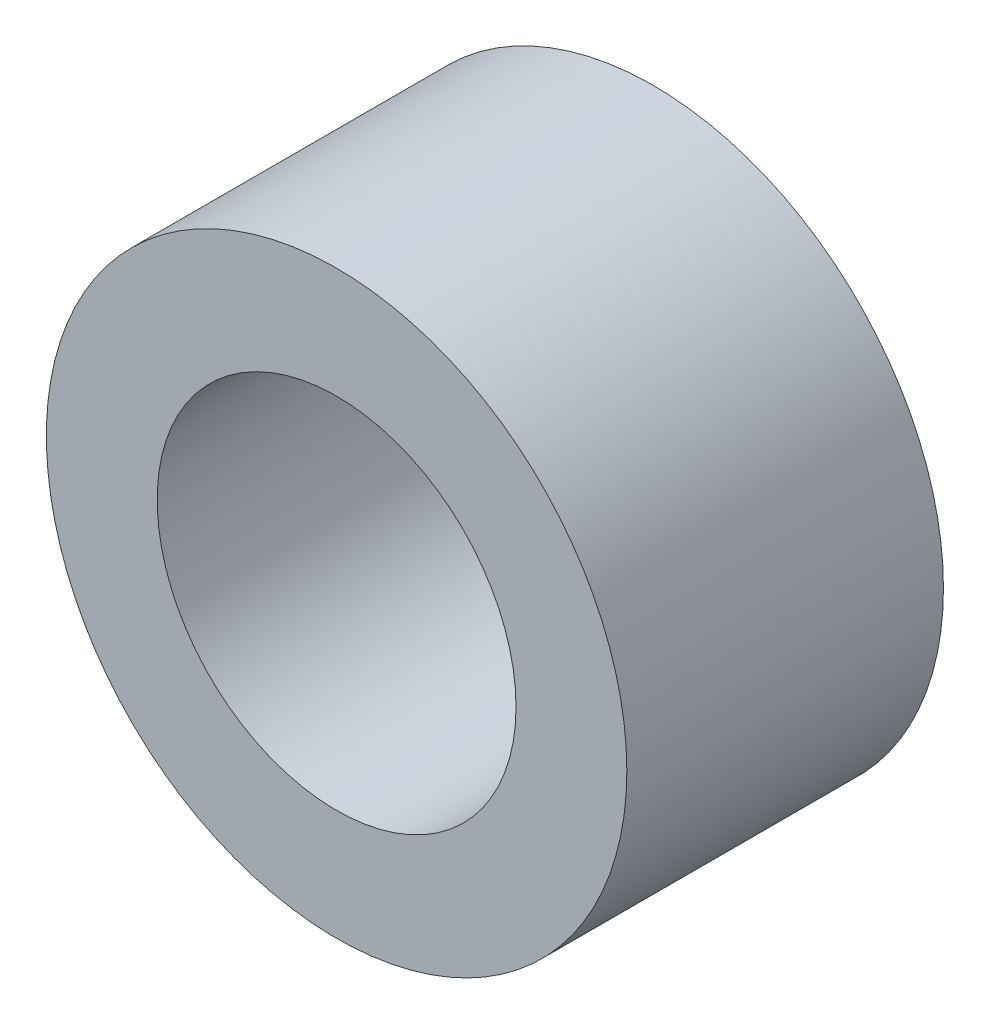
ISO-10303-21;
HEADER;
FILE_DESCRIPTION(('STEP AP214'),'2;1');
FILE_NAME('part.step','',(''),(''),'','','');
FILE_SCHEMA(('AUTOMOTIVE_DESIGN { 1 0 10303 214 1 1 1 1 }'));
ENDSEC;
DATA;
#1=APPLICATION_CONTEXT('core data for automotive mechanical design processes');
#2=APPLICATION_PROTOCOL_DEFINITION('international standard','automotive_design',2000,#1);
#3=PRODUCT_CONTEXT('',#1,'mechanical');
#4=PRODUCT('Part','Part','',(#3));
#5=PRODUCT_RELATED_PRODUCT_CATEGORY('part','',(#4));
#6=PRODUCT_DEFINITION_FORMATION('','',#4);
#7=PRODUCT_DEFINITION_CONTEXT('part definition',#1,'design');
#8=PRODUCT_DEFINITION('design','',#6,#7);
#9=PRODUCT_DEFINITION_SHAPE('','',#8);
#10=(LENGTH_UNIT() NAMED_UNIT(*) SI_UNIT(.MILLI.,.METRE.));
#11=(NAMED_UNIT(*) PLANE_ANGLE_UNIT() SI_UNIT($,.RADIAN.));
#12=(NAMED_UNIT(*) SI_UNIT($,.STERADIAN.) SOLID_ANGLE_UNIT());
#13=UNCERTAINTY_MEASURE_WITH_UNIT(LENGTH_MEASURE(1.E-05),#10,'distance_accuracy_value','');
#14=(GEOMETRIC_REPRESENTATION_CONTEXT(3) GLOBAL_UNCERTAINTY_ASSIGNED_CONTEXT((#13)) GLOBAL_UNIT_ASSIGNED_CONTEXT((#10,
#11,#12)) REPRESENTATION_CONTEXT('',''));
#15=CARTESIAN_POINT('',(0.,0.,0.));
#16=DIRECTION('',(0.,0.,1.));
#17=DIRECTION('',(1.,0.,0.));
#18=AXIS2_PLACEMENT_3D('',#15,#16,#17);
#19=CARTESIAN_POINT('',(0.,0.,6.));
#20=DIRECTION('',(0.,0.,1.));
#21=DIRECTION('',(1.,0.,0.));
#22=AXIS2_PLACEMENT_3D('',#19,#20,#21);
#23=PLANE('',#22);
#24=CARTESIAN_POINT('',(0.,0.,6.));
#25=DIRECTION('',(0.,0.,1.));
#26=DIRECTION('',(1.,0.,0.));
#27=AXIS2_PLACEMENT_3D('',#24,#25,#26);
#28=CIRCLE('',#27,5.5);
#29=CARTESIAN_POINT('',(5.5,0.,6.));
#30=VERTEX_POINT('',#29);
#31=EDGE_CURVE('E10',#30,#30,#28,.T.);
#32=ORIENTED_EDGE('',*,*,#31,.T.);
#33=EDGE_LOOP('',(#32));
#34=FACE_BOUND('',#33,.T.);
#35=CARTESIAN_POINT('',(0.,0.,6.));
#36=DIRECTION('',(0.,0.,1.));
#37=DIRECTION('',(1.,0.,0.));
#38=AXIS2_PLACEMENT_3D('',#35,#36,#37);
#39=CIRCLE('',#38,3.4);
#40=CARTESIAN_POINT('',(3.4,0.,6.));
#41=VERTEX_POINT('',#40);
#42=EDGE_CURVE('E48',#41,#41,#39,.T.);
#43=ORIENTED_EDGE('',*,*,#42,.F.);
#44=EDGE_LOOP('',(#43));
#45=FACE_BOUND('',#44,.T.);
#46=ADVANCED_FACE('F37',(#34,#45),#23,.T.);
#47=CARTESIAN_POINT('',(0.,0.,0.));
#48=DIRECTION('',(0.,0.,1.));
#49=DIRECTION('',(1.,0.,0.));
#50=AXIS2_PLACEMENT_3D('',#47,#48,#49);
#51=PLANE('',#50);
#52=CARTESIAN_POINT('',(0.,0.,0.));
#53=DIRECTION('',(0.,0.,1.));
#54=DIRECTION('',(1.,0.,0.));
#55=AXIS2_PLACEMENT_3D('',#52,#53,#54);
#56=CIRCLE('',#55,5.5);
#57=CARTESIAN_POINT('',(5.5,0.,0.));
#58=VERTEX_POINT('',#57);
#59=EDGE_CURVE('E41',#58,#58,#56,.T.);
#60=ORIENTED_EDGE('',*,*,#59,.F.);
#61=EDGE_LOOP('',(#60));
#62=FACE_BOUND('',#61,.T.);
#63=CARTESIAN_POINT('',(0.,0.,0.));
#64=DIRECTION('',(0.,0.,1.));
#65=DIRECTION('',(1.,0.,0.));
#66=AXIS2_PLACEMENT_3D('',#63,#64,#65);
#67=CIRCLE('',#66,3.4);
#68=CARTESIAN_POINT('',(3.4,0.,0.));
#69=VERTEX_POINT('',#68);
#70=EDGE_CURVE('E50',#69,#69,#67,.T.);
#71=ORIENTED_EDGE('',*,*,#70,.T.);
#72=EDGE_LOOP('',(#71));
#73=FACE_BOUND('',#72,.T.);
#74=ADVANCED_FACE('F60',(#62,#73),#51,.F.);
#75=CARTESIAN_POINT('',(0.,0.,6.));
#76=DIRECTION('',(0.,0.,-1.));
#77=DIRECTION('',(-1.,0.,0.));
#78=AXIS2_PLACEMENT_3D('',#75,#76,#77);
#79=CYLINDRICAL_SURFACE('',#78,5.5);
#80=ORIENTED_EDGE('',*,*,#31,.F.);
#81=EDGE_LOOP('',(#80));
#82=FACE_BOUND('',#81,.T.);
#83=ORIENTED_EDGE('',*,*,#59,.T.);
#84=EDGE_LOOP('',(#83));
#85=FACE_BOUND('',#84,.T.);
#86=ADVANCED_FACE('F39',(#82,#85),#79,.T.);
#87=CARTESIAN_POINT('',(0.,0.,6.));
#88=DIRECTION('',(0.,0.,-1.));
#89=DIRECTION('',(-1.,0.,0.));
#90=AXIS2_PLACEMENT_3D('',#87,#88,#89);
#91=CYLINDRICAL_SURFACE('',#90,3.4);
#92=ORIENTED_EDGE('',*,*,#42,.T.);
#93=EDGE_LOOP('',(#92));
#94=FACE_BOUND('',#93,.T.);
#95=ORIENTED_EDGE('',*,*,#70,.F.);
#96=EDGE_LOOP('',(#95));
#97=FACE_BOUND('',#96,.T.);
#98=ADVANCED_FACE('F56',(#94,#97),#91,.F.);
#99=CLOSED_SHELL('',(#46,#74,#86,#98));
#100=MANIFOLD_SOLID_BREP('B2',#99);
#101=ADVANCED_BREP_SHAPE_REPRESENTATION('',(#18,#100),#14);
#102=SHAPE_DEFINITION_REPRESENTATION(#9,#101);
ENDSEC;
END-ISO-10303-21;
